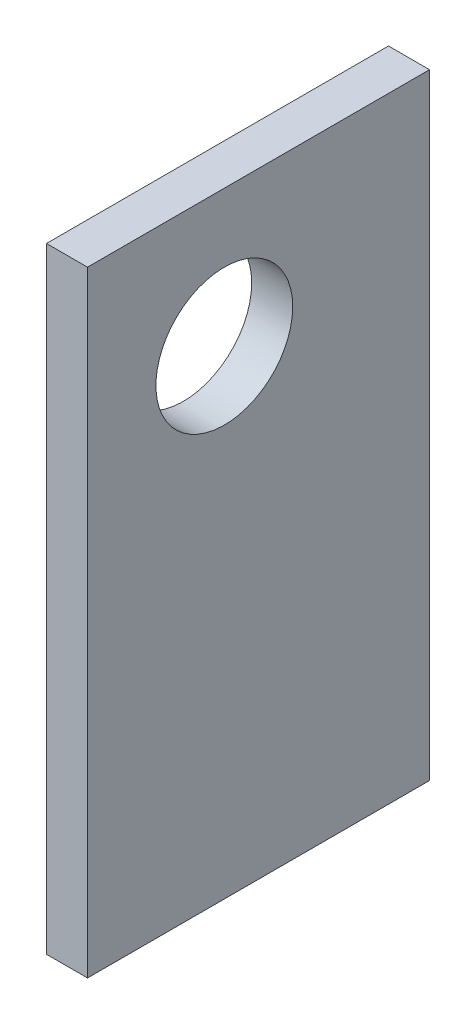
ISO-10303-21;
HEADER;
FILE_DESCRIPTION(('STEP AP214'),'2;1');
FILE_NAME('part.step','',(''),(''),'','','');
FILE_SCHEMA(('AUTOMOTIVE_DESIGN { 1 0 10303 214 1 1 1 1 }'));
ENDSEC;
DATA;
#1=APPLICATION_CONTEXT('core data for automotive mechanical design processes');
#2=APPLICATION_PROTOCOL_DEFINITION('international standard','automotive_design',2000,#1);
#3=PRODUCT_CONTEXT('',#1,'mechanical');
#4=PRODUCT('Part','Part','',(#3));
#5=PRODUCT_RELATED_PRODUCT_CATEGORY('part','',(#4));
#6=PRODUCT_DEFINITION_FORMATION('','',#4);
#7=PRODUCT_DEFINITION_CONTEXT('part definition',#1,'design');
#8=PRODUCT_DEFINITION('design','',#6,#7);
#9=PRODUCT_DEFINITION_SHAPE('','',#8);
#10=(LENGTH_UNIT() NAMED_UNIT(*) SI_UNIT(.MILLI.,.METRE.));
#11=(NAMED_UNIT(*) PLANE_ANGLE_UNIT() SI_UNIT($,.RADIAN.));
#12=(NAMED_UNIT(*) SI_UNIT($,.STERADIAN.) SOLID_ANGLE_UNIT());
#13=UNCERTAINTY_MEASURE_WITH_UNIT(LENGTH_MEASURE(1.E-05),#10,'distance_accuracy_value','');
#14=(GEOMETRIC_REPRESENTATION_CONTEXT(3) GLOBAL_UNCERTAINTY_ASSIGNED_CONTEXT((#13)) GLOBAL_UNIT_ASSIGNED_CONTEXT((#10,
#11,#12)) REPRESENTATION_CONTEXT('',''));
#15=CARTESIAN_POINT('',(0.,0.,0.));
#16=DIRECTION('',(0.,0.,1.));
#17=DIRECTION('',(1.,0.,0.));
#18=AXIS2_PLACEMENT_3D('',#15,#16,#17);
#19=CARTESIAN_POINT('',(3.,-22.5,-12.5));
#20=DIRECTION('',(0.,0.,1.));
#21=DIRECTION('',(1.,0.,0.));
#22=AXIS2_PLACEMENT_3D('',#19,#20,#21);
#23=PLANE('',#22);
#24=DIRECTION('',(0.,1.,0.));
#25=VECTOR('',#24,1.);
#26=CARTESIAN_POINT('',(0.,-22.5,-12.5));
#27=LINE('',#26,#25);
#28=CARTESIAN_POINT('',(0.,-22.5,-12.5));
#29=VERTEX_POINT('',#28);
#30=CARTESIAN_POINT('',(0.,22.5,-12.5));
#31=VERTEX_POINT('',#30);
#32=EDGE_CURVE('E98',#29,#31,#27,.T.);
#33=ORIENTED_EDGE('',*,*,#32,.T.);
#34=DIRECTION('',(-1.,0.,0.));
#35=VECTOR('',#34,1.);
#36=CARTESIAN_POINT('',(3.,22.5,-12.5));
#37=LINE('',#36,#35);
#38=CARTESIAN_POINT('',(3.,22.5,-12.5));
#39=VERTEX_POINT('',#38);
#40=EDGE_CURVE('E11',#39,#31,#37,.T.);
#41=ORIENTED_EDGE('',*,*,#40,.F.);
#42=DIRECTION('',(0.,1.,0.));
#43=VECTOR('',#42,1.);
#44=CARTESIAN_POINT('',(3.,-22.5,-12.5));
#45=LINE('',#44,#43);
#46=CARTESIAN_POINT('',(3.,-22.5,-12.5));
#47=VERTEX_POINT('',#46);
#48=EDGE_CURVE('E86',#47,#39,#45,.T.);
#49=ORIENTED_EDGE('',*,*,#48,.F.);
#50=DIRECTION('',(-1.,0.,0.));
#51=VECTOR('',#50,1.);
#52=CARTESIAN_POINT('',(3.,-22.5,-12.5));
#53=LINE('',#52,#51);
#54=EDGE_CURVE('E94',#47,#29,#53,.T.);
#55=ORIENTED_EDGE('',*,*,#54,.T.);
#56=EDGE_LOOP('',(#33,#41,#49,#55));
#57=FACE_BOUND('',#56,.T.);
#58=ADVANCED_FACE('F35',(#57),#23,.F.);
#59=CARTESIAN_POINT('',(3.,22.5,12.5));
#60=DIRECTION('',(0.,-1.,0.));
#61=DIRECTION('',(0.,0.,-1.));
#62=AXIS2_PLACEMENT_3D('',#59,#60,#61);
#63=PLANE('',#62);
#64=DIRECTION('',(0.,0.,1.));
#65=VECTOR('',#64,1.);
#66=CARTESIAN_POINT('',(0.,22.5,12.5));
#67=LINE('',#66,#65);
#68=CARTESIAN_POINT('',(0.,22.5,12.5));
#69=VERTEX_POINT('',#68);
#70=EDGE_CURVE('E90',#31,#69,#67,.T.);
#71=ORIENTED_EDGE('',*,*,#70,.T.);
#72=DIRECTION('',(-1.,0.,0.));
#73=VECTOR('',#72,1.);
#74=CARTESIAN_POINT('',(3.,22.5,12.5));
#75=LINE('',#74,#73);
#76=CARTESIAN_POINT('',(3.,22.5,12.5));
#77=VERTEX_POINT('',#76);
#78=EDGE_CURVE('E43',#77,#69,#75,.T.);
#79=ORIENTED_EDGE('',*,*,#78,.F.);
#80=DIRECTION('',(0.,0.,1.));
#81=VECTOR('',#80,1.);
#82=CARTESIAN_POINT('',(3.,22.5,12.5));
#83=LINE('',#82,#81);
#84=EDGE_CURVE('E81',#39,#77,#83,.T.);
#85=ORIENTED_EDGE('',*,*,#84,.F.);
#86=ORIENTED_EDGE('',*,*,#40,.T.);
#87=EDGE_LOOP('',(#71,#79,#85,#86));
#88=FACE_BOUND('',#87,.T.);
#89=ADVANCED_FACE('F89',(#88),#63,.F.);
#90=CARTESIAN_POINT('',(3.,-22.5,12.5));
#91=DIRECTION('',(0.,0.,-1.));
#92=DIRECTION('',(0.,1.,0.));
#93=AXIS2_PLACEMENT_3D('',#90,#91,#92);
#94=PLANE('',#93);
#95=DIRECTION('',(0.,-1.,0.));
#96=VECTOR('',#95,1.);
#97=CARTESIAN_POINT('',(0.,-22.5,12.5));
#98=LINE('',#97,#96);
#99=CARTESIAN_POINT('',(0.,-22.5,12.5));
#100=VERTEX_POINT('',#99);
#101=EDGE_CURVE('E68',#69,#100,#98,.T.);
#102=ORIENTED_EDGE('',*,*,#101,.T.);
#103=DIRECTION('',(-1.,0.,0.));
#104=VECTOR('',#103,1.);
#105=CARTESIAN_POINT('',(3.,-22.5,12.5));
#106=LINE('',#105,#104);
#107=CARTESIAN_POINT('',(3.,-22.5,12.5));
#108=VERTEX_POINT('',#107);
#109=EDGE_CURVE('E91',#108,#100,#106,.T.);
#110=ORIENTED_EDGE('',*,*,#109,.F.);
#111=DIRECTION('',(0.,-1.,0.));
#112=VECTOR('',#111,1.);
#113=CARTESIAN_POINT('',(3.,-22.5,12.5));
#114=LINE('',#113,#112);
#115=EDGE_CURVE('E84',#77,#108,#114,.T.);
#116=ORIENTED_EDGE('',*,*,#115,.F.);
#117=ORIENTED_EDGE('',*,*,#78,.T.);
#118=EDGE_LOOP('',(#102,#110,#116,#117));
#119=FACE_BOUND('',#118,.T.);
#120=ADVANCED_FACE('F92',(#119),#94,.F.);
#121=CARTESIAN_POINT('',(3.,-22.5,12.5));
#122=DIRECTION('',(0.,1.,0.));
#123=DIRECTION('',(0.,0.,1.));
#124=AXIS2_PLACEMENT_3D('',#121,#122,#123);
#125=PLANE('',#124);
#126=DIRECTION('',(0.,0.,-1.));
#127=VECTOR('',#126,1.);
#128=CARTESIAN_POINT('',(0.,-22.5,12.5));
#129=LINE('',#128,#127);
#130=EDGE_CURVE('E74',#100,#29,#129,.T.);
#131=ORIENTED_EDGE('',*,*,#130,.T.);
#132=ORIENTED_EDGE('',*,*,#54,.F.);
#133=DIRECTION('',(0.,0.,-1.));
#134=VECTOR('',#133,1.);
#135=CARTESIAN_POINT('',(3.,-22.5,12.5));
#136=LINE('',#135,#134);
#137=EDGE_CURVE('E51',#108,#47,#136,.T.);
#138=ORIENTED_EDGE('',*,*,#137,.F.);
#139=ORIENTED_EDGE('',*,*,#109,.T.);
#140=EDGE_LOOP('',(#131,#132,#138,#139));
#141=FACE_BOUND('',#140,.T.);
#142=ADVANCED_FACE('F106',(#141),#125,.F.);
#143=CARTESIAN_POINT('',(3.,0.,0.));
#144=DIRECTION('',(-1.,0.,0.));
#145=DIRECTION('',(0.,0.,1.));
#146=AXIS2_PLACEMENT_3D('',#143,#144,#145);
#147=PLANE('',#146);
#148=CARTESIAN_POINT('',(3.,12.5,2.50000000000002));
#149=DIRECTION('',(1.,0.,0.));
#150=DIRECTION('',(0.,0.,-1.));
#151=AXIS2_PLACEMENT_3D('',#148,#149,#150);
#152=CIRCLE('',#151,5.);
#153=CARTESIAN_POINT('',(3.,12.5,-2.49999999999999));
#154=VERTEX_POINT('',#153);
#155=EDGE_CURVE('E112',#154,#154,#152,.T.);
#156=ORIENTED_EDGE('',*,*,#155,.F.);
#157=EDGE_LOOP('',(#156));
#158=FACE_BOUND('',#157,.T.);
#159=ORIENTED_EDGE('',*,*,#48,.T.);
#160=ORIENTED_EDGE('',*,*,#84,.T.);
#161=ORIENTED_EDGE('',*,*,#115,.T.);
#162=ORIENTED_EDGE('',*,*,#137,.T.);
#163=EDGE_LOOP('',(#159,#160,#161,#162));
#164=FACE_BOUND('',#163,.T.);
#165=ADVANCED_FACE('F82',(#158,#164),#147,.F.);
#166=CARTESIAN_POINT('',(0.,0.,0.));
#167=DIRECTION('',(-1.,0.,0.));
#168=DIRECTION('',(0.,0.,1.));
#169=AXIS2_PLACEMENT_3D('',#166,#167,#168);
#170=PLANE('',#169);
#171=CARTESIAN_POINT('',(0.,12.5,2.50000000000002));
#172=DIRECTION('',(1.,0.,0.));
#173=DIRECTION('',(0.,0.,-1.));
#174=AXIS2_PLACEMENT_3D('',#171,#172,#173);
#175=CIRCLE('',#174,5.);
#176=CARTESIAN_POINT('',(0.,12.5,-2.49999999999999));
#177=VERTEX_POINT('',#176);
#178=EDGE_CURVE('E101',#177,#177,#175,.T.);
#179=ORIENTED_EDGE('',*,*,#178,.T.);
#180=EDGE_LOOP('',(#179));
#181=FACE_BOUND('',#180,.T.);
#182=ORIENTED_EDGE('',*,*,#32,.F.);
#183=ORIENTED_EDGE('',*,*,#130,.F.);
#184=ORIENTED_EDGE('',*,*,#101,.F.);
#185=ORIENTED_EDGE('',*,*,#70,.F.);
#186=EDGE_LOOP('',(#182,#183,#184,#185));
#187=FACE_BOUND('',#186,.T.);
#188=ADVANCED_FACE('F109',(#181,#187),#170,.T.);
#189=CARTESIAN_POINT('',(0.,12.5,2.50000000000002));
#190=DIRECTION('',(1.,0.,0.));
#191=DIRECTION('',(0.,0.,-1.));
#192=AXIS2_PLACEMENT_3D('',#189,#190,#191);
#193=CYLINDRICAL_SURFACE('',#192,5.);
#194=ORIENTED_EDGE('',*,*,#178,.F.);
#195=EDGE_LOOP('',(#194));
#196=FACE_BOUND('',#195,.T.);
#197=ORIENTED_EDGE('',*,*,#155,.T.);
#198=EDGE_LOOP('',(#197));
#199=FACE_BOUND('',#198,.T.);
#200=ADVANCED_FACE('F119',(#196,#199),#193,.F.);
#201=CLOSED_SHELL('',(#58,#89,#120,#142,#165,#188,#200));
#202=MANIFOLD_SOLID_BREP('B2',#201);
#203=ADVANCED_BREP_SHAPE_REPRESENTATION('',(#18,#202),#14);
#204=SHAPE_DEFINITION_REPRESENTATION(#9,#203);
ENDSEC;
END-ISO-10303-21;
